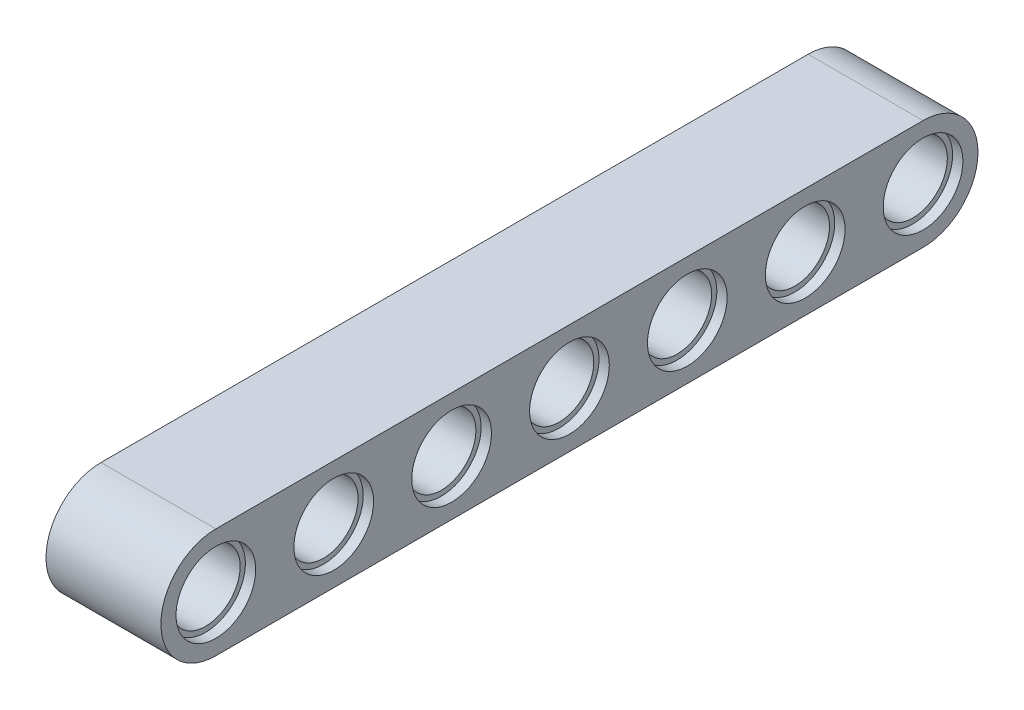
ISO-10303-21;
HEADER;
FILE_DESCRIPTION(('STEP AP214'),'2;1');
FILE_NAME('part.step','',(''),(''),'','','');
FILE_SCHEMA(('AUTOMOTIVE_DESIGN { 1 0 10303 214 1 1 1 1 }'));
ENDSEC;
DATA;
#1=APPLICATION_CONTEXT('core data for automotive mechanical design processes');
#2=APPLICATION_PROTOCOL_DEFINITION('international standard','automotive_design',2000,#1);
#3=PRODUCT_CONTEXT('',#1,'mechanical');
#4=PRODUCT('Part','Part','',(#3));
#5=PRODUCT_RELATED_PRODUCT_CATEGORY('part','',(#4));
#6=PRODUCT_DEFINITION_FORMATION('','',#4);
#7=PRODUCT_DEFINITION_CONTEXT('part definition',#1,'design');
#8=PRODUCT_DEFINITION('design','',#6,#7);
#9=PRODUCT_DEFINITION_SHAPE('','',#8);
#10=(LENGTH_UNIT() NAMED_UNIT(*) SI_UNIT(.MILLI.,.METRE.));
#11=(NAMED_UNIT(*) PLANE_ANGLE_UNIT() SI_UNIT($,.RADIAN.));
#12=(NAMED_UNIT(*) SI_UNIT($,.STERADIAN.) SOLID_ANGLE_UNIT());
#13=UNCERTAINTY_MEASURE_WITH_UNIT(LENGTH_MEASURE(1.E-05),#10,'distance_accuracy_value','');
#14=(GEOMETRIC_REPRESENTATION_CONTEXT(3) GLOBAL_UNCERTAINTY_ASSIGNED_CONTEXT((#13)) GLOBAL_UNIT_ASSIGNED_CONTEXT((#10,
#11,#12)) REPRESENTATION_CONTEXT('',''));
#15=CARTESIAN_POINT('',(0.,0.,0.));
#16=DIRECTION('',(0.,0.,1.));
#17=DIRECTION('',(1.,0.,0.));
#18=AXIS2_PLACEMENT_3D('',#15,#16,#17);
#19=CARTESIAN_POINT('',(7.8,0.,16.));
#20=DIRECTION('',(-1.,0.,0.));
#21=DIRECTION('',(0.,0.,1.));
#22=AXIS2_PLACEMENT_3D('',#19,#20,#21);
#23=CYLINDRICAL_SURFACE('',#22,2.35);
#24=CARTESIAN_POINT('',(0.7,0.,16.));
#25=DIRECTION('',(-1.,0.,0.));
#26=DIRECTION('',(0.,0.,1.));
#27=AXIS2_PLACEMENT_3D('',#24,#25,#26);
#28=CIRCLE('',#27,2.35);
#29=CARTESIAN_POINT('',(0.7,0.,18.35));
#30=VERTEX_POINT('',#29);
#31=EDGE_CURVE('E125',#30,#30,#28,.T.);
#32=ORIENTED_EDGE('',*,*,#31,.T.);
#33=EDGE_LOOP('',(#32));
#34=FACE_BOUND('',#33,.T.);
#35=CARTESIAN_POINT('',(7.1,0.,16.));
#36=DIRECTION('',(1.,0.,0.));
#37=DIRECTION('',(0.,0.,-1.));
#38=AXIS2_PLACEMENT_3D('',#35,#36,#37);
#39=CIRCLE('',#38,2.35);
#40=CARTESIAN_POINT('',(7.1,0.,13.65));
#41=VERTEX_POINT('',#40);
#42=EDGE_CURVE('E37',#41,#41,#39,.T.);
#43=ORIENTED_EDGE('',*,*,#42,.T.);
#44=EDGE_LOOP('',(#43));
#45=FACE_BOUND('',#44,.T.);
#46=ADVANCED_FACE('F33',(#34,#45),#23,.F.);
#47=CARTESIAN_POINT('',(7.8,0.,8.));
#48=DIRECTION('',(-1.,0.,0.));
#49=DIRECTION('',(0.,0.,1.));
#50=AXIS2_PLACEMENT_3D('',#47,#48,#49);
#51=CYLINDRICAL_SURFACE('',#50,2.35);
#52=CARTESIAN_POINT('',(0.7,0.,8.));
#53=DIRECTION('',(-1.,0.,0.));
#54=DIRECTION('',(0.,0.,1.));
#55=AXIS2_PLACEMENT_3D('',#52,#53,#54);
#56=CIRCLE('',#55,2.35);
#57=CARTESIAN_POINT('',(0.7,0.,10.35));
#58=VERTEX_POINT('',#57);
#59=EDGE_CURVE('E122',#58,#58,#56,.T.);
#60=ORIENTED_EDGE('',*,*,#59,.T.);
#61=EDGE_LOOP('',(#60));
#62=FACE_BOUND('',#61,.T.);
#63=CARTESIAN_POINT('',(7.1,0.,8.));
#64=DIRECTION('',(1.,0.,0.));
#65=DIRECTION('',(0.,0.,-1.));
#66=AXIS2_PLACEMENT_3D('',#63,#64,#65);
#67=CIRCLE('',#66,2.35);
#68=CARTESIAN_POINT('',(7.1,0.,5.65));
#69=VERTEX_POINT('',#68);
#70=EDGE_CURVE('E149',#69,#69,#67,.T.);
#71=ORIENTED_EDGE('',*,*,#70,.T.);
#72=EDGE_LOOP('',(#71));
#73=FACE_BOUND('',#72,.T.);
#74=ADVANCED_FACE('F225',(#62,#73),#51,.F.);
#75=CARTESIAN_POINT('',(7.8,0.,0.));
#76=DIRECTION('',(-1.,0.,0.));
#77=DIRECTION('',(0.,0.,1.));
#78=AXIS2_PLACEMENT_3D('',#75,#76,#77);
#79=CYLINDRICAL_SURFACE('',#78,2.35);
#80=CARTESIAN_POINT('',(0.7,0.,0.));
#81=DIRECTION('',(-1.,0.,0.));
#82=DIRECTION('',(0.,0.,1.));
#83=AXIS2_PLACEMENT_3D('',#80,#81,#82);
#84=CIRCLE('',#83,2.35);
#85=CARTESIAN_POINT('',(0.7,0.,2.34999999999999));
#86=VERTEX_POINT('',#85);
#87=EDGE_CURVE('E119',#86,#86,#84,.T.);
#88=ORIENTED_EDGE('',*,*,#87,.T.);
#89=EDGE_LOOP('',(#88));
#90=FACE_BOUND('',#89,.T.);
#91=CARTESIAN_POINT('',(7.1,0.,0.));
#92=DIRECTION('',(1.,0.,0.));
#93=DIRECTION('',(0.,0.,-1.));
#94=AXIS2_PLACEMENT_3D('',#91,#92,#93);
#95=CIRCLE('',#94,2.35);
#96=CARTESIAN_POINT('',(7.1,0.,-2.35));
#97=VERTEX_POINT('',#96);
#98=EDGE_CURVE('E147',#97,#97,#95,.T.);
#99=ORIENTED_EDGE('',*,*,#98,.T.);
#100=EDGE_LOOP('',(#99));
#101=FACE_BOUND('',#100,.T.);
#102=ADVANCED_FACE('F231',(#90,#101),#79,.F.);
#103=CARTESIAN_POINT('',(7.8,0.,-8.));
#104=DIRECTION('',(-1.,0.,0.));
#105=DIRECTION('',(0.,0.,1.));
#106=AXIS2_PLACEMENT_3D('',#103,#104,#105);
#107=CYLINDRICAL_SURFACE('',#106,2.35);
#108=CARTESIAN_POINT('',(0.7,0.,-8.));
#109=DIRECTION('',(-1.,0.,0.));
#110=DIRECTION('',(0.,0.,1.));
#111=AXIS2_PLACEMENT_3D('',#108,#109,#110);
#112=CIRCLE('',#111,2.35);
#113=CARTESIAN_POINT('',(0.7,0.,-5.65000000000001));
#114=VERTEX_POINT('',#113);
#115=EDGE_CURVE('E115',#114,#114,#112,.T.);
#116=ORIENTED_EDGE('',*,*,#115,.T.);
#117=EDGE_LOOP('',(#116));
#118=FACE_BOUND('',#117,.T.);
#119=CARTESIAN_POINT('',(7.1,0.,-8.));
#120=DIRECTION('',(1.,0.,0.));
#121=DIRECTION('',(0.,0.,-1.));
#122=AXIS2_PLACEMENT_3D('',#119,#120,#121);
#123=CIRCLE('',#122,2.35);
#124=CARTESIAN_POINT('',(7.1,0.,-10.35));
#125=VERTEX_POINT('',#124);
#126=EDGE_CURVE('E144',#125,#125,#123,.T.);
#127=ORIENTED_EDGE('',*,*,#126,.T.);
#128=EDGE_LOOP('',(#127));
#129=FACE_BOUND('',#128,.T.);
#130=ADVANCED_FACE('F411',(#118,#129),#107,.F.);
#131=CARTESIAN_POINT('',(7.8,0.,-16.));
#132=DIRECTION('',(-1.,0.,0.));
#133=DIRECTION('',(0.,0.,1.));
#134=AXIS2_PLACEMENT_3D('',#131,#132,#133);
#135=CYLINDRICAL_SURFACE('',#134,2.35);
#136=CARTESIAN_POINT('',(0.7,0.,-16.));
#137=DIRECTION('',(-1.,0.,0.));
#138=DIRECTION('',(0.,0.,1.));
#139=AXIS2_PLACEMENT_3D('',#136,#137,#138);
#140=CIRCLE('',#139,2.35);
#141=CARTESIAN_POINT('',(0.7,0.,-13.65));
#142=VERTEX_POINT('',#141);
#143=EDGE_CURVE('E112',#142,#142,#140,.T.);
#144=ORIENTED_EDGE('',*,*,#143,.T.);
#145=EDGE_LOOP('',(#144));
#146=FACE_BOUND('',#145,.T.);
#147=CARTESIAN_POINT('',(7.1,0.,-16.));
#148=DIRECTION('',(1.,0.,0.));
#149=DIRECTION('',(0.,0.,-1.));
#150=AXIS2_PLACEMENT_3D('',#147,#148,#149);
#151=CIRCLE('',#150,2.35);
#152=CARTESIAN_POINT('',(7.1,0.,-18.35));
#153=VERTEX_POINT('',#152);
#154=EDGE_CURVE('E140',#153,#153,#151,.T.);
#155=ORIENTED_EDGE('',*,*,#154,.T.);
#156=EDGE_LOOP('',(#155));
#157=FACE_BOUND('',#156,.T.);
#158=ADVANCED_FACE('F407',(#146,#157),#135,.F.);
#159=CARTESIAN_POINT('',(7.8,0.,-24.));
#160=DIRECTION('',(-1.,0.,0.));
#161=DIRECTION('',(0.,0.,1.));
#162=AXIS2_PLACEMENT_3D('',#159,#160,#161);
#163=CYLINDRICAL_SURFACE('',#162,2.35);
#164=CARTESIAN_POINT('',(0.7,0.,-24.));
#165=DIRECTION('',(-1.,0.,0.));
#166=DIRECTION('',(0.,0.,1.));
#167=AXIS2_PLACEMENT_3D('',#164,#165,#166);
#168=CIRCLE('',#167,2.35);
#169=CARTESIAN_POINT('',(0.7,0.,-21.65));
#170=VERTEX_POINT('',#169);
#171=EDGE_CURVE('E103',#170,#170,#168,.T.);
#172=ORIENTED_EDGE('',*,*,#171,.T.);
#173=EDGE_LOOP('',(#172));
#174=FACE_BOUND('',#173,.T.);
#175=CARTESIAN_POINT('',(7.1,0.,-24.));
#176=DIRECTION('',(1.,0.,0.));
#177=DIRECTION('',(0.,0.,-1.));
#178=AXIS2_PLACEMENT_3D('',#175,#176,#177);
#179=CIRCLE('',#178,2.35);
#180=CARTESIAN_POINT('',(7.1,0.,-26.35));
#181=VERTEX_POINT('',#180);
#182=EDGE_CURVE('E137',#181,#181,#179,.T.);
#183=ORIENTED_EDGE('',*,*,#182,.T.);
#184=EDGE_LOOP('',(#183));
#185=FACE_BOUND('',#184,.T.);
#186=ADVANCED_FACE('F239',(#174,#185),#163,.F.);
#187=CARTESIAN_POINT('',(7.8,0.,24.));
#188=DIRECTION('',(-1.,0.,0.));
#189=DIRECTION('',(0.,0.,1.));
#190=AXIS2_PLACEMENT_3D('',#187,#188,#189);
#191=CYLINDRICAL_SURFACE('',#190,2.35);
#192=CARTESIAN_POINT('',(0.7,0.,24.));
#193=DIRECTION('',(-1.,0.,0.));
#194=DIRECTION('',(0.,0.,1.));
#195=AXIS2_PLACEMENT_3D('',#192,#193,#194);
#196=CIRCLE('',#195,2.35);
#197=CARTESIAN_POINT('',(0.7,0.,26.35));
#198=VERTEX_POINT('',#197);
#199=EDGE_CURVE('E128',#198,#198,#196,.T.);
#200=ORIENTED_EDGE('',*,*,#199,.T.);
#201=EDGE_LOOP('',(#200));
#202=FACE_BOUND('',#201,.T.);
#203=CARTESIAN_POINT('',(7.1,0.,24.));
#204=DIRECTION('',(1.,0.,0.));
#205=DIRECTION('',(0.,0.,-1.));
#206=AXIS2_PLACEMENT_3D('',#203,#204,#205);
#207=CIRCLE('',#206,2.35);
#208=CARTESIAN_POINT('',(7.1,0.,21.65));
#209=VERTEX_POINT('',#208);
#210=EDGE_CURVE('E132',#209,#209,#207,.T.);
#211=ORIENTED_EDGE('',*,*,#210,.T.);
#212=EDGE_LOOP('',(#211));
#213=FACE_BOUND('',#212,.T.);
#214=ADVANCED_FACE('F236',(#202,#213),#191,.F.);
#215=CARTESIAN_POINT('',(7.8,0.,-24.));
#216=DIRECTION('',(1.,0.,0.));
#217=DIRECTION('',(0.,0.,-1.));
#218=AXIS2_PLACEMENT_3D('',#215,#216,#217);
#219=PLANE('',#218);
#220=CARTESIAN_POINT('',(7.8,0.,16.));
#221=DIRECTION('',(1.,0.,0.));
#222=DIRECTION('',(0.,0.,-1.));
#223=AXIS2_PLACEMENT_3D('',#220,#221,#222);
#224=CIRCLE('',#223,2.705);
#225=CARTESIAN_POINT('',(7.8,0.,13.295));
#226=VERTEX_POINT('',#225);
#227=EDGE_CURVE('E248',#226,#226,#224,.T.);
#228=ORIENTED_EDGE('',*,*,#227,.F.);
#229=EDGE_LOOP('',(#228));
#230=FACE_BOUND('',#229,.T.);
#231=CARTESIAN_POINT('',(7.8,0.,8.));
#232=DIRECTION('',(1.,0.,0.));
#233=DIRECTION('',(0.,0.,-1.));
#234=AXIS2_PLACEMENT_3D('',#231,#232,#233);
#235=CIRCLE('',#234,2.705);
#236=CARTESIAN_POINT('',(7.8,0.,5.295));
#237=VERTEX_POINT('',#236);
#238=EDGE_CURVE('E252',#237,#237,#235,.T.);
#239=ORIENTED_EDGE('',*,*,#238,.F.);
#240=EDGE_LOOP('',(#239));
#241=FACE_BOUND('',#240,.T.);
#242=CARTESIAN_POINT('',(7.8,0.,0.));
#243=DIRECTION('',(1.,0.,0.));
#244=DIRECTION('',(0.,0.,-1.));
#245=AXIS2_PLACEMENT_3D('',#242,#243,#244);
#246=CIRCLE('',#245,2.705);
#247=CARTESIAN_POINT('',(7.8,0.,-2.705));
#248=VERTEX_POINT('',#247);
#249=EDGE_CURVE('E256',#248,#248,#246,.T.);
#250=ORIENTED_EDGE('',*,*,#249,.F.);
#251=EDGE_LOOP('',(#250));
#252=FACE_BOUND('',#251,.T.);
#253=CARTESIAN_POINT('',(7.8,0.,-8.));
#254=DIRECTION('',(1.,0.,0.));
#255=DIRECTION('',(0.,0.,-1.));
#256=AXIS2_PLACEMENT_3D('',#253,#254,#255);
#257=CIRCLE('',#256,2.705);
#258=CARTESIAN_POINT('',(7.8,0.,-10.705));
#259=VERTEX_POINT('',#258);
#260=EDGE_CURVE('E260',#259,#259,#257,.T.);
#261=ORIENTED_EDGE('',*,*,#260,.F.);
#262=EDGE_LOOP('',(#261));
#263=FACE_BOUND('',#262,.T.);
#264=CARTESIAN_POINT('',(7.8,0.,-16.));
#265=DIRECTION('',(1.,0.,0.));
#266=DIRECTION('',(0.,0.,-1.));
#267=AXIS2_PLACEMENT_3D('',#264,#265,#266);
#268=CIRCLE('',#267,2.705);
#269=CARTESIAN_POINT('',(7.8,0.,-18.705));
#270=VERTEX_POINT('',#269);
#271=EDGE_CURVE('E264',#270,#270,#268,.T.);
#272=ORIENTED_EDGE('',*,*,#271,.F.);
#273=EDGE_LOOP('',(#272));
#274=FACE_BOUND('',#273,.T.);
#275=CARTESIAN_POINT('',(7.8,0.,-24.));
#276=DIRECTION('',(1.,0.,0.));
#277=DIRECTION('',(0.,0.,-1.));
#278=AXIS2_PLACEMENT_3D('',#275,#276,#277);
#279=CIRCLE('',#278,2.705);
#280=CARTESIAN_POINT('',(7.8,0.,-26.705));
#281=VERTEX_POINT('',#280);
#282=EDGE_CURVE('E268',#281,#281,#279,.T.);
#283=ORIENTED_EDGE('',*,*,#282,.F.);
#284=EDGE_LOOP('',(#283));
#285=FACE_BOUND('',#284,.T.);
#286=CARTESIAN_POINT('',(7.8,0.,24.));
#287=DIRECTION('',(1.,0.,0.));
#288=DIRECTION('',(0.,0.,-1.));
#289=AXIS2_PLACEMENT_3D('',#286,#287,#288);
#290=CIRCLE('',#289,2.705);
#291=CARTESIAN_POINT('',(7.8,0.,21.295));
#292=VERTEX_POINT('',#291);
#293=EDGE_CURVE('E154',#292,#292,#290,.T.);
#294=ORIENTED_EDGE('',*,*,#293,.F.);
#295=EDGE_LOOP('',(#294));
#296=FACE_BOUND('',#295,.T.);
#297=CARTESIAN_POINT('',(7.8,0.,-24.));
#298=DIRECTION('',(1.,0.,0.));
#299=DIRECTION('',(0.,0.,-1.));
#300=AXIS2_PLACEMENT_3D('',#297,#298,#299);
#301=CIRCLE('',#300,3.73);
#302=CARTESIAN_POINT('',(7.8,-3.73,-24.));
#303=VERTEX_POINT('',#302);
#304=CARTESIAN_POINT('',(7.8,3.73,-24.));
#305=VERTEX_POINT('',#304);
#306=EDGE_CURVE('E87',#303,#305,#301,.T.);
#307=ORIENTED_EDGE('',*,*,#306,.T.);
#308=DIRECTION('',(0.,0.,1.));
#309=VECTOR('',#308,1.);
#310=CARTESIAN_POINT('',(7.8,3.73,24.));
#311=LINE('',#310,#309);
#312=CARTESIAN_POINT('',(7.8,3.73,24.));
#313=VERTEX_POINT('',#312);
#314=EDGE_CURVE('E82',#305,#313,#311,.T.);
#315=ORIENTED_EDGE('',*,*,#314,.T.);
#316=CARTESIAN_POINT('',(7.8,0.,24.));
#317=DIRECTION('',(1.,0.,0.));
#318=DIRECTION('',(0.,0.,-1.));
#319=AXIS2_PLACEMENT_3D('',#316,#317,#318);
#320=CIRCLE('',#319,3.73);
#321=CARTESIAN_POINT('',(7.8,-3.73,24.));
#322=VERTEX_POINT('',#321);
#323=EDGE_CURVE('E85',#313,#322,#320,.T.);
#324=ORIENTED_EDGE('',*,*,#323,.T.);
#325=DIRECTION('',(0.,0.,-1.));
#326=VECTOR('',#325,1.);
#327=CARTESIAN_POINT('',(7.8,-3.73,24.));
#328=LINE('',#327,#326);
#329=EDGE_CURVE('E52',#322,#303,#328,.T.);
#330=ORIENTED_EDGE('',*,*,#329,.T.);
#331=EDGE_LOOP('',(#307,#315,#324,#330));
#332=FACE_BOUND('',#331,.T.);
#333=ADVANCED_FACE('F83',(#230,#241,#252,#263,#274,#285,#296,#332),#219,.T.);
#334=CARTESIAN_POINT('',(0.,0.,-24.));
#335=DIRECTION('',(1.,0.,0.));
#336=DIRECTION('',(0.,0.,-1.));
#337=AXIS2_PLACEMENT_3D('',#334,#335,#336);
#338=PLANE('',#337);
#339=CARTESIAN_POINT('',(0.,0.,-16.));
#340=DIRECTION('',(-1.,0.,0.));
#341=DIRECTION('',(0.,0.,1.));
#342=AXIS2_PLACEMENT_3D('',#339,#340,#341);
#343=CIRCLE('',#342,2.705);
#344=CARTESIAN_POINT('',(0.,0.,-13.295));
#345=VERTEX_POINT('',#344);
#346=EDGE_CURVE('E167',#345,#345,#343,.T.);
#347=ORIENTED_EDGE('',*,*,#346,.F.);
#348=EDGE_LOOP('',(#347));
#349=FACE_BOUND('',#348,.T.);
#350=CARTESIAN_POINT('',(0.,0.,-8.));
#351=DIRECTION('',(-1.,0.,0.));
#352=DIRECTION('',(0.,0.,1.));
#353=AXIS2_PLACEMENT_3D('',#350,#351,#352);
#354=CIRCLE('',#353,2.705);
#355=CARTESIAN_POINT('',(0.,0.,-5.295));
#356=VERTEX_POINT('',#355);
#357=EDGE_CURVE('E173',#356,#356,#354,.T.);
#358=ORIENTED_EDGE('',*,*,#357,.F.);
#359=EDGE_LOOP('',(#358));
#360=FACE_BOUND('',#359,.T.);
#361=CARTESIAN_POINT('',(0.,0.,0.));
#362=DIRECTION('',(-1.,0.,0.));
#363=DIRECTION('',(0.,0.,1.));
#364=AXIS2_PLACEMENT_3D('',#361,#362,#363);
#365=CIRCLE('',#364,2.705);
#366=CARTESIAN_POINT('',(0.,0.,2.705));
#367=VERTEX_POINT('',#366);
#368=EDGE_CURVE('E179',#367,#367,#365,.T.);
#369=ORIENTED_EDGE('',*,*,#368,.F.);
#370=EDGE_LOOP('',(#369));
#371=FACE_BOUND('',#370,.T.);
#372=CARTESIAN_POINT('',(0.,0.,8.));
#373=DIRECTION('',(-1.,0.,0.));
#374=DIRECTION('',(0.,0.,1.));
#375=AXIS2_PLACEMENT_3D('',#372,#373,#374);
#376=CIRCLE('',#375,2.705);
#377=CARTESIAN_POINT('',(0.,0.,10.705));
#378=VERTEX_POINT('',#377);
#379=EDGE_CURVE('E185',#378,#378,#376,.T.);
#380=ORIENTED_EDGE('',*,*,#379,.F.);
#381=EDGE_LOOP('',(#380));
#382=FACE_BOUND('',#381,.T.);
#383=CARTESIAN_POINT('',(0.,0.,16.));
#384=DIRECTION('',(-1.,0.,0.));
#385=DIRECTION('',(0.,0.,1.));
#386=AXIS2_PLACEMENT_3D('',#383,#384,#385);
#387=CIRCLE('',#386,2.705);
#388=CARTESIAN_POINT('',(0.,0.,18.705));
#389=VERTEX_POINT('',#388);
#390=EDGE_CURVE('E191',#389,#389,#387,.T.);
#391=ORIENTED_EDGE('',*,*,#390,.F.);
#392=EDGE_LOOP('',(#391));
#393=FACE_BOUND('',#392,.T.);
#394=CARTESIAN_POINT('',(0.,0.,24.));
#395=DIRECTION('',(-1.,0.,0.));
#396=DIRECTION('',(0.,0.,1.));
#397=AXIS2_PLACEMENT_3D('',#394,#395,#396);
#398=CIRCLE('',#397,2.705);
#399=CARTESIAN_POINT('',(0.,0.,26.705));
#400=VERTEX_POINT('',#399);
#401=EDGE_CURVE('E135',#400,#400,#398,.T.);
#402=ORIENTED_EDGE('',*,*,#401,.F.);
#403=EDGE_LOOP('',(#402));
#404=FACE_BOUND('',#403,.T.);
#405=CARTESIAN_POINT('',(0.,0.,-24.));
#406=DIRECTION('',(-1.,0.,0.));
#407=DIRECTION('',(0.,0.,1.));
#408=AXIS2_PLACEMENT_3D('',#405,#406,#407);
#409=CIRCLE('',#408,2.705);
#410=CARTESIAN_POINT('',(0.,0.,-21.295));
#411=VERTEX_POINT('',#410);
#412=EDGE_CURVE('E131',#411,#411,#409,.T.);
#413=ORIENTED_EDGE('',*,*,#412,.F.);
#414=EDGE_LOOP('',(#413));
#415=FACE_BOUND('',#414,.T.);
#416=CARTESIAN_POINT('',(0.,0.,-24.));
#417=DIRECTION('',(1.,0.,0.));
#418=DIRECTION('',(0.,0.,-1.));
#419=AXIS2_PLACEMENT_3D('',#416,#417,#418);
#420=CIRCLE('',#419,3.73);
#421=CARTESIAN_POINT('',(0.,-3.73,-24.));
#422=VERTEX_POINT('',#421);
#423=CARTESIAN_POINT('',(0.,3.73,-24.));
#424=VERTEX_POINT('',#423);
#425=EDGE_CURVE('E100',#422,#424,#420,.T.);
#426=ORIENTED_EDGE('',*,*,#425,.F.);
#427=DIRECTION('',(0.,0.,-1.));
#428=VECTOR('',#427,1.);
#429=CARTESIAN_POINT('',(0.,-3.73,24.));
#430=LINE('',#429,#428);
#431=CARTESIAN_POINT('',(0.,-3.73,24.));
#432=VERTEX_POINT('',#431);
#433=EDGE_CURVE('E75',#432,#422,#430,.T.);
#434=ORIENTED_EDGE('',*,*,#433,.F.);
#435=CARTESIAN_POINT('',(0.,0.,24.));
#436=DIRECTION('',(1.,0.,0.));
#437=DIRECTION('',(0.,0.,-1.));
#438=AXIS2_PLACEMENT_3D('',#435,#436,#437);
#439=CIRCLE('',#438,3.73);
#440=CARTESIAN_POINT('',(0.,3.73,24.));
#441=VERTEX_POINT('',#440);
#442=EDGE_CURVE('E69',#441,#432,#439,.T.);
#443=ORIENTED_EDGE('',*,*,#442,.F.);
#444=DIRECTION('',(0.,0.,1.));
#445=VECTOR('',#444,1.);
#446=CARTESIAN_POINT('',(0.,3.73,24.));
#447=LINE('',#446,#445);
#448=EDGE_CURVE('E91',#424,#441,#447,.T.);
#449=ORIENTED_EDGE('',*,*,#448,.F.);
#450=EDGE_LOOP('',(#426,#434,#443,#449));
#451=FACE_BOUND('',#450,.T.);
#452=ADVANCED_FACE('F206',(#349,#360,#371,#382,#393,#404,#415,#451),#338,.F.);
#453=CARTESIAN_POINT('',(7.8,0.,-24.));
#454=DIRECTION('',(-1.,0.,0.));
#455=DIRECTION('',(0.,0.,1.));
#456=AXIS2_PLACEMENT_3D('',#453,#454,#455);
#457=CYLINDRICAL_SURFACE('',#456,3.73);
#458=ORIENTED_EDGE('',*,*,#425,.T.);
#459=DIRECTION('',(-1.,0.,0.));
#460=VECTOR('',#459,1.);
#461=CARTESIAN_POINT('',(7.8,3.73,-24.));
#462=LINE('',#461,#460);
#463=EDGE_CURVE('E11',#305,#424,#462,.T.);
#464=ORIENTED_EDGE('',*,*,#463,.F.);
#465=ORIENTED_EDGE('',*,*,#306,.F.);
#466=DIRECTION('',(-1.,0.,0.));
#467=VECTOR('',#466,1.);
#468=CARTESIAN_POINT('',(7.8,-3.73,-24.));
#469=LINE('',#468,#467);
#470=EDGE_CURVE('E96',#303,#422,#469,.T.);
#471=ORIENTED_EDGE('',*,*,#470,.T.);
#472=EDGE_LOOP('',(#458,#464,#465,#471));
#473=FACE_BOUND('',#472,.T.);
#474=ADVANCED_FACE('F35',(#473),#457,.T.);
#475=CARTESIAN_POINT('',(7.8,3.73,24.));
#476=DIRECTION('',(0.,-1.,0.));
#477=DIRECTION('',(0.,0.,-1.));
#478=AXIS2_PLACEMENT_3D('',#475,#476,#477);
#479=PLANE('',#478);
#480=ORIENTED_EDGE('',*,*,#448,.T.);
#481=DIRECTION('',(-1.,0.,0.));
#482=VECTOR('',#481,1.);
#483=CARTESIAN_POINT('',(7.8,3.73,24.));
#484=LINE('',#483,#482);
#485=EDGE_CURVE('E43',#313,#441,#484,.T.);
#486=ORIENTED_EDGE('',*,*,#485,.F.);
#487=ORIENTED_EDGE('',*,*,#314,.F.);
#488=ORIENTED_EDGE('',*,*,#463,.T.);
#489=EDGE_LOOP('',(#480,#486,#487,#488));
#490=FACE_BOUND('',#489,.T.);
#491=ADVANCED_FACE('F90',(#490),#479,.F.);
#492=CARTESIAN_POINT('',(7.8,0.,24.));
#493=DIRECTION('',(-1.,0.,0.));
#494=DIRECTION('',(0.,0.,1.));
#495=AXIS2_PLACEMENT_3D('',#492,#493,#494);
#496=CYLINDRICAL_SURFACE('',#495,3.73);
#497=ORIENTED_EDGE('',*,*,#442,.T.);
#498=DIRECTION('',(-1.,0.,0.));
#499=VECTOR('',#498,1.);
#500=CARTESIAN_POINT('',(7.8,-3.73,24.));
#501=LINE('',#500,#499);
#502=EDGE_CURVE('E92',#322,#432,#501,.T.);
#503=ORIENTED_EDGE('',*,*,#502,.F.);
#504=ORIENTED_EDGE('',*,*,#323,.F.);
#505=ORIENTED_EDGE('',*,*,#485,.T.);
#506=EDGE_LOOP('',(#497,#503,#504,#505));
#507=FACE_BOUND('',#506,.T.);
#508=ADVANCED_FACE('F94',(#507),#496,.T.);
#509=CARTESIAN_POINT('',(7.8,-3.73,24.));
#510=DIRECTION('',(0.,1.,0.));
#511=DIRECTION('',(0.,0.,1.));
#512=AXIS2_PLACEMENT_3D('',#509,#510,#511);
#513=PLANE('',#512);
#514=ORIENTED_EDGE('',*,*,#433,.T.);
#515=ORIENTED_EDGE('',*,*,#470,.F.);
#516=ORIENTED_EDGE('',*,*,#329,.F.);
#517=ORIENTED_EDGE('',*,*,#502,.T.);
#518=EDGE_LOOP('',(#514,#515,#516,#517));
#519=FACE_BOUND('',#518,.T.);
#520=ADVANCED_FACE('F213',(#519),#513,.F.);
#521=CARTESIAN_POINT('',(0.7,0.,-24.));
#522=DIRECTION('',(-1.,0.,0.));
#523=DIRECTION('',(0.,0.,1.));
#524=AXIS2_PLACEMENT_3D('',#521,#522,#523);
#525=CYLINDRICAL_SURFACE('',#524,2.705);
#526=CARTESIAN_POINT('',(0.7,0.,-24.));
#527=DIRECTION('',(-1.,0.,0.));
#528=DIRECTION('',(0.,0.,1.));
#529=AXIS2_PLACEMENT_3D('',#526,#527,#528);
#530=CIRCLE('',#529,2.705);
#531=CARTESIAN_POINT('',(0.7,0.,-21.295));
#532=VERTEX_POINT('',#531);
#533=EDGE_CURVE('E111',#532,#532,#530,.T.);
#534=ORIENTED_EDGE('',*,*,#533,.F.);
#535=EDGE_LOOP('',(#534));
#536=FACE_BOUND('',#535,.T.);
#537=ORIENTED_EDGE('',*,*,#412,.T.);
#538=EDGE_LOOP('',(#537));
#539=FACE_BOUND('',#538,.T.);
#540=ADVANCED_FACE('F204',(#536,#539),#525,.F.);
#541=CARTESIAN_POINT('',(0.7,0.,-24.));
#542=DIRECTION('',(-1.,0.,0.));
#543=DIRECTION('',(0.,0.,1.));
#544=AXIS2_PLACEMENT_3D('',#541,#542,#543);
#545=PLANE('',#544);
#546=ORIENTED_EDGE('',*,*,#171,.F.);
#547=EDGE_LOOP('',(#546));
#548=FACE_BOUND('',#547,.T.);
#549=ORIENTED_EDGE('',*,*,#533,.T.);
#550=EDGE_LOOP('',(#549));
#551=FACE_BOUND('',#550,.T.);
#552=ADVANCED_FACE('F220',(#548,#551),#545,.T.);
#553=CARTESIAN_POINT('',(0.7,0.,-16.));
#554=DIRECTION('',(-1.,0.,0.));
#555=DIRECTION('',(0.,0.,1.));
#556=AXIS2_PLACEMENT_3D('',#553,#554,#555);
#557=CYLINDRICAL_SURFACE('',#556,2.705);
#558=CARTESIAN_POINT('',(0.7,0.,-16.));
#559=DIRECTION('',(-1.,0.,0.));
#560=DIRECTION('',(0.,0.,1.));
#561=AXIS2_PLACEMENT_3D('',#558,#559,#560);
#562=CIRCLE('',#561,2.705);
#563=CARTESIAN_POINT('',(0.7,0.,-13.295));
#564=VERTEX_POINT('',#563);
#565=EDGE_CURVE('E116',#564,#564,#562,.T.);
#566=ORIENTED_EDGE('',*,*,#565,.F.);
#567=EDGE_LOOP('',(#566));
#568=FACE_BOUND('',#567,.T.);
#569=ORIENTED_EDGE('',*,*,#346,.T.);
#570=EDGE_LOOP('',(#569));
#571=FACE_BOUND('',#570,.T.);
#572=ADVANCED_FACE('F359',(#568,#571),#557,.F.);
#573=CARTESIAN_POINT('',(0.7,0.,-16.));
#574=DIRECTION('',(-1.,0.,0.));
#575=DIRECTION('',(0.,0.,1.));
#576=AXIS2_PLACEMENT_3D('',#573,#574,#575);
#577=PLANE('',#576);
#578=ORIENTED_EDGE('',*,*,#143,.F.);
#579=EDGE_LOOP('',(#578));
#580=FACE_BOUND('',#579,.T.);
#581=ORIENTED_EDGE('',*,*,#565,.T.);
#582=EDGE_LOOP('',(#581));
#583=FACE_BOUND('',#582,.T.);
#584=ADVANCED_FACE('F355',(#580,#583),#577,.T.);
#585=CARTESIAN_POINT('',(0.7,0.,-8.));
#586=DIRECTION('',(-1.,0.,0.));
#587=DIRECTION('',(0.,0.,1.));
#588=AXIS2_PLACEMENT_3D('',#585,#586,#587);
#589=CYLINDRICAL_SURFACE('',#588,2.705);
#590=CARTESIAN_POINT('',(0.7,0.,-8.));
#591=DIRECTION('',(-1.,0.,0.));
#592=DIRECTION('',(0.,0.,1.));
#593=AXIS2_PLACEMENT_3D('',#590,#591,#592);
#594=CIRCLE('',#593,2.705);
#595=CARTESIAN_POINT('',(0.7,0.,-5.295));
#596=VERTEX_POINT('',#595);
#597=EDGE_CURVE('E170',#596,#596,#594,.T.);
#598=ORIENTED_EDGE('',*,*,#597,.F.);
#599=EDGE_LOOP('',(#598));
#600=FACE_BOUND('',#599,.T.);
#601=ORIENTED_EDGE('',*,*,#357,.T.);
#602=EDGE_LOOP('',(#601));
#603=FACE_BOUND('',#602,.T.);
#604=ADVANCED_FACE('F358',(#600,#603),#589,.F.);
#605=CARTESIAN_POINT('',(0.7,0.,-8.));
#606=DIRECTION('',(-1.,0.,0.));
#607=DIRECTION('',(0.,0.,1.));
#608=AXIS2_PLACEMENT_3D('',#605,#606,#607);
#609=PLANE('',#608);
#610=ORIENTED_EDGE('',*,*,#115,.F.);
#611=EDGE_LOOP('',(#610));
#612=FACE_BOUND('',#611,.T.);
#613=ORIENTED_EDGE('',*,*,#597,.T.);
#614=EDGE_LOOP('',(#613));
#615=FACE_BOUND('',#614,.T.);
#616=ADVANCED_FACE('F364',(#612,#615),#609,.T.);
#617=CARTESIAN_POINT('',(0.7,0.,0.));
#618=DIRECTION('',(-1.,0.,0.));
#619=DIRECTION('',(0.,0.,1.));
#620=AXIS2_PLACEMENT_3D('',#617,#618,#619);
#621=CYLINDRICAL_SURFACE('',#620,2.705);
#622=CARTESIAN_POINT('',(0.7,0.,0.));
#623=DIRECTION('',(-1.,0.,0.));
#624=DIRECTION('',(0.,0.,1.));
#625=AXIS2_PLACEMENT_3D('',#622,#623,#624);
#626=CIRCLE('',#625,2.705);
#627=CARTESIAN_POINT('',(0.7,0.,2.705));
#628=VERTEX_POINT('',#627);
#629=EDGE_CURVE('E176',#628,#628,#626,.T.);
#630=ORIENTED_EDGE('',*,*,#629,.F.);
#631=EDGE_LOOP('',(#630));
#632=FACE_BOUND('',#631,.T.);
#633=ORIENTED_EDGE('',*,*,#368,.T.);
#634=EDGE_LOOP('',(#633));
#635=FACE_BOUND('',#634,.T.);
#636=ADVANCED_FACE('F367',(#632,#635),#621,.F.);
#637=CARTESIAN_POINT('',(0.7,0.,0.));
#638=DIRECTION('',(-1.,0.,0.));
#639=DIRECTION('',(0.,0.,1.));
#640=AXIS2_PLACEMENT_3D('',#637,#638,#639);
#641=PLANE('',#640);
#642=ORIENTED_EDGE('',*,*,#87,.F.);
#643=EDGE_LOOP('',(#642));
#644=FACE_BOUND('',#643,.T.);
#645=ORIENTED_EDGE('',*,*,#629,.T.);
#646=EDGE_LOOP('',(#645));
#647=FACE_BOUND('',#646,.T.);
#648=ADVANCED_FACE('F372',(#644,#647),#641,.T.);
#649=CARTESIAN_POINT('',(0.7,0.,8.));
#650=DIRECTION('',(-1.,0.,0.));
#651=DIRECTION('',(0.,0.,1.));
#652=AXIS2_PLACEMENT_3D('',#649,#650,#651);
#653=CYLINDRICAL_SURFACE('',#652,2.705);
#654=CARTESIAN_POINT('',(0.7,0.,8.));
#655=DIRECTION('',(-1.,0.,0.));
#656=DIRECTION('',(0.,0.,1.));
#657=AXIS2_PLACEMENT_3D('',#654,#655,#656);
#658=CIRCLE('',#657,2.705);
#659=CARTESIAN_POINT('',(0.7,0.,10.705));
#660=VERTEX_POINT('',#659);
#661=EDGE_CURVE('E182',#660,#660,#658,.T.);
#662=ORIENTED_EDGE('',*,*,#661,.F.);
#663=EDGE_LOOP('',(#662));
#664=FACE_BOUND('',#663,.T.);
#665=ORIENTED_EDGE('',*,*,#379,.T.);
#666=EDGE_LOOP('',(#665));
#667=FACE_BOUND('',#666,.T.);
#668=ADVANCED_FACE('F375',(#664,#667),#653,.F.);
#669=CARTESIAN_POINT('',(0.7,0.,8.));
#670=DIRECTION('',(-1.,0.,0.));
#671=DIRECTION('',(0.,0.,1.));
#672=AXIS2_PLACEMENT_3D('',#669,#670,#671);
#673=PLANE('',#672);
#674=ORIENTED_EDGE('',*,*,#59,.F.);
#675=EDGE_LOOP('',(#674));
#676=FACE_BOUND('',#675,.T.);
#677=ORIENTED_EDGE('',*,*,#661,.T.);
#678=EDGE_LOOP('',(#677));
#679=FACE_BOUND('',#678,.T.);
#680=ADVANCED_FACE('F380',(#676,#679),#673,.T.);
#681=CARTESIAN_POINT('',(0.7,0.,16.));
#682=DIRECTION('',(-1.,0.,0.));
#683=DIRECTION('',(0.,0.,1.));
#684=AXIS2_PLACEMENT_3D('',#681,#682,#683);
#685=CYLINDRICAL_SURFACE('',#684,2.705);
#686=CARTESIAN_POINT('',(0.7,0.,16.));
#687=DIRECTION('',(-1.,0.,0.));
#688=DIRECTION('',(0.,0.,1.));
#689=AXIS2_PLACEMENT_3D('',#686,#687,#688);
#690=CIRCLE('',#689,2.705);
#691=CARTESIAN_POINT('',(0.7,0.,18.705));
#692=VERTEX_POINT('',#691);
#693=EDGE_CURVE('E188',#692,#692,#690,.T.);
#694=ORIENTED_EDGE('',*,*,#693,.F.);
#695=EDGE_LOOP('',(#694));
#696=FACE_BOUND('',#695,.T.);
#697=ORIENTED_EDGE('',*,*,#390,.T.);
#698=EDGE_LOOP('',(#697));
#699=FACE_BOUND('',#698,.T.);
#700=ADVANCED_FACE('F383',(#696,#699),#685,.F.);
#701=CARTESIAN_POINT('',(0.7,0.,16.));
#702=DIRECTION('',(-1.,0.,0.));
#703=DIRECTION('',(0.,0.,1.));
#704=AXIS2_PLACEMENT_3D('',#701,#702,#703);
#705=PLANE('',#704);
#706=ORIENTED_EDGE('',*,*,#31,.F.);
#707=EDGE_LOOP('',(#706));
#708=FACE_BOUND('',#707,.T.);
#709=ORIENTED_EDGE('',*,*,#693,.T.);
#710=EDGE_LOOP('',(#709));
#711=FACE_BOUND('',#710,.T.);
#712=ADVANCED_FACE('F388',(#708,#711),#705,.T.);
#713=CARTESIAN_POINT('',(0.7,0.,24.));
#714=DIRECTION('',(-1.,0.,0.));
#715=DIRECTION('',(0.,0.,1.));
#716=AXIS2_PLACEMENT_3D('',#713,#714,#715);
#717=CYLINDRICAL_SURFACE('',#716,2.705);
#718=CARTESIAN_POINT('',(0.7,0.,24.));
#719=DIRECTION('',(-1.,0.,0.));
#720=DIRECTION('',(0.,0.,1.));
#721=AXIS2_PLACEMENT_3D('',#718,#719,#720);
#722=CIRCLE('',#721,2.705);
#723=CARTESIAN_POINT('',(0.7,0.,26.705));
#724=VERTEX_POINT('',#723);
#725=EDGE_CURVE('E194',#724,#724,#722,.T.);
#726=ORIENTED_EDGE('',*,*,#725,.F.);
#727=EDGE_LOOP('',(#726));
#728=FACE_BOUND('',#727,.T.);
#729=ORIENTED_EDGE('',*,*,#401,.T.);
#730=EDGE_LOOP('',(#729));
#731=FACE_BOUND('',#730,.T.);
#732=ADVANCED_FACE('F391',(#728,#731),#717,.F.);
#733=CARTESIAN_POINT('',(0.7,0.,24.));
#734=DIRECTION('',(-1.,0.,0.));
#735=DIRECTION('',(0.,0.,1.));
#736=AXIS2_PLACEMENT_3D('',#733,#734,#735);
#737=PLANE('',#736);
#738=ORIENTED_EDGE('',*,*,#199,.F.);
#739=EDGE_LOOP('',(#738));
#740=FACE_BOUND('',#739,.T.);
#741=ORIENTED_EDGE('',*,*,#725,.T.);
#742=EDGE_LOOP('',(#741));
#743=FACE_BOUND('',#742,.T.);
#744=ADVANCED_FACE('F353',(#740,#743),#737,.T.);
#745=CARTESIAN_POINT('',(7.1,0.,24.));
#746=DIRECTION('',(1.,0.,0.));
#747=DIRECTION('',(0.,0.,-1.));
#748=AXIS2_PLACEMENT_3D('',#745,#746,#747);
#749=CYLINDRICAL_SURFACE('',#748,2.705);
#750=CARTESIAN_POINT('',(7.1,0.,24.));
#751=DIRECTION('',(1.,0.,0.));
#752=DIRECTION('',(0.,0.,-1.));
#753=AXIS2_PLACEMENT_3D('',#750,#751,#752);
#754=CIRCLE('',#753,2.705);
#755=CARTESIAN_POINT('',(7.1,0.,21.295));
#756=VERTEX_POINT('',#755);
#757=EDGE_CURVE('E136',#756,#756,#754,.T.);
#758=ORIENTED_EDGE('',*,*,#757,.F.);
#759=EDGE_LOOP('',(#758));
#760=FACE_BOUND('',#759,.T.);
#761=ORIENTED_EDGE('',*,*,#293,.T.);
#762=EDGE_LOOP('',(#761));
#763=FACE_BOUND('',#762,.T.);
#764=ADVANCED_FACE('F349',(#760,#763),#749,.F.);
#765=CARTESIAN_POINT('',(7.1,0.,24.));
#766=DIRECTION('',(1.,0.,0.));
#767=DIRECTION('',(0.,0.,-1.));
#768=AXIS2_PLACEMENT_3D('',#765,#766,#767);
#769=PLANE('',#768);
#770=ORIENTED_EDGE('',*,*,#210,.F.);
#771=EDGE_LOOP('',(#770));
#772=FACE_BOUND('',#771,.T.);
#773=ORIENTED_EDGE('',*,*,#757,.T.);
#774=EDGE_LOOP('',(#773));
#775=FACE_BOUND('',#774,.T.);
#776=ADVANCED_FACE('F345',(#772,#775),#769,.T.);
#777=CARTESIAN_POINT('',(7.1,0.,-24.));
#778=DIRECTION('',(1.,0.,0.));
#779=DIRECTION('',(0.,0.,-1.));
#780=AXIS2_PLACEMENT_3D('',#777,#778,#779);
#781=CYLINDRICAL_SURFACE('',#780,2.705);
#782=CARTESIAN_POINT('',(7.1,0.,-24.));
#783=DIRECTION('',(1.,0.,0.));
#784=DIRECTION('',(0.,0.,-1.));
#785=AXIS2_PLACEMENT_3D('',#782,#783,#784);
#786=CIRCLE('',#785,2.705);
#787=CARTESIAN_POINT('',(7.1,0.,-26.705));
#788=VERTEX_POINT('',#787);
#789=EDGE_CURVE('E270',#788,#788,#786,.T.);
#790=ORIENTED_EDGE('',*,*,#789,.F.);
#791=EDGE_LOOP('',(#790));
#792=FACE_BOUND('',#791,.T.);
#793=ORIENTED_EDGE('',*,*,#282,.T.);
#794=EDGE_LOOP('',(#793));
#795=FACE_BOUND('',#794,.T.);
#796=ADVANCED_FACE('F341',(#792,#795),#781,.F.);
#797=CARTESIAN_POINT('',(7.1,0.,-24.));
#798=DIRECTION('',(1.,0.,0.));
#799=DIRECTION('',(0.,0.,-1.));
#800=AXIS2_PLACEMENT_3D('',#797,#798,#799);
#801=PLANE('',#800);
#802=ORIENTED_EDGE('',*,*,#182,.F.);
#803=EDGE_LOOP('',(#802));
#804=FACE_BOUND('',#803,.T.);
#805=ORIENTED_EDGE('',*,*,#789,.T.);
#806=EDGE_LOOP('',(#805));
#807=FACE_BOUND('',#806,.T.);
#808=ADVANCED_FACE('F337',(#804,#807),#801,.T.);
#809=CARTESIAN_POINT('',(7.1,0.,-16.));
#810=DIRECTION('',(1.,0.,0.));
#811=DIRECTION('',(0.,0.,-1.));
#812=AXIS2_PLACEMENT_3D('',#809,#810,#811);
#813=CYLINDRICAL_SURFACE('',#812,2.705);
#814=CARTESIAN_POINT('',(7.1,0.,-16.));
#815=DIRECTION('',(1.,0.,0.));
#816=DIRECTION('',(0.,0.,-1.));
#817=AXIS2_PLACEMENT_3D('',#814,#815,#816);
#818=CIRCLE('',#817,2.705);
#819=CARTESIAN_POINT('',(7.1,0.,-18.705));
#820=VERTEX_POINT('',#819);
#821=EDGE_CURVE('E275',#820,#820,#818,.T.);
#822=ORIENTED_EDGE('',*,*,#821,.F.);
#823=EDGE_LOOP('',(#822));
#824=FACE_BOUND('',#823,.T.);
#825=ORIENTED_EDGE('',*,*,#271,.T.);
#826=EDGE_LOOP('',(#825));
#827=FACE_BOUND('',#826,.T.);
#828=ADVANCED_FACE('F333',(#824,#827),#813,.F.);
#829=CARTESIAN_POINT('',(7.1,0.,-16.));
#830=DIRECTION('',(1.,0.,0.));
#831=DIRECTION('',(0.,0.,-1.));
#832=AXIS2_PLACEMENT_3D('',#829,#830,#831);
#833=PLANE('',#832);
#834=ORIENTED_EDGE('',*,*,#154,.F.);
#835=EDGE_LOOP('',(#834));
#836=FACE_BOUND('',#835,.T.);
#837=ORIENTED_EDGE('',*,*,#821,.T.);
#838=EDGE_LOOP('',(#837));
#839=FACE_BOUND('',#838,.T.);
#840=ADVANCED_FACE('F329',(#836,#839),#833,.T.);
#841=CARTESIAN_POINT('',(7.1,0.,-8.));
#842=DIRECTION('',(1.,0.,0.));
#843=DIRECTION('',(0.,0.,-1.));
#844=AXIS2_PLACEMENT_3D('',#841,#842,#843);
#845=CYLINDRICAL_SURFACE('',#844,2.705);
#846=CARTESIAN_POINT('',(7.1,0.,-8.));
#847=DIRECTION('',(1.,0.,0.));
#848=DIRECTION('',(0.,0.,-1.));
#849=AXIS2_PLACEMENT_3D('',#846,#847,#848);
#850=CIRCLE('',#849,2.705);
#851=CARTESIAN_POINT('',(7.1,0.,-10.705));
#852=VERTEX_POINT('',#851);
#853=EDGE_CURVE('E279',#852,#852,#850,.T.);
#854=ORIENTED_EDGE('',*,*,#853,.F.);
#855=EDGE_LOOP('',(#854));
#856=FACE_BOUND('',#855,.T.);
#857=ORIENTED_EDGE('',*,*,#260,.T.);
#858=EDGE_LOOP('',(#857));
#859=FACE_BOUND('',#858,.T.);
#860=ADVANCED_FACE('F325',(#856,#859),#845,.F.);
#861=CARTESIAN_POINT('',(7.1,0.,-8.));
#862=DIRECTION('',(1.,0.,0.));
#863=DIRECTION('',(0.,0.,-1.));
#864=AXIS2_PLACEMENT_3D('',#861,#862,#863);
#865=PLANE('',#864);
#866=ORIENTED_EDGE('',*,*,#126,.F.);
#867=EDGE_LOOP('',(#866));
#868=FACE_BOUND('',#867,.T.);
#869=ORIENTED_EDGE('',*,*,#853,.T.);
#870=EDGE_LOOP('',(#869));
#871=FACE_BOUND('',#870,.T.);
#872=ADVANCED_FACE('F321',(#868,#871),#865,.T.);
#873=CARTESIAN_POINT('',(7.1,0.,0.));
#874=DIRECTION('',(1.,0.,0.));
#875=DIRECTION('',(0.,0.,-1.));
#876=AXIS2_PLACEMENT_3D('',#873,#874,#875);
#877=CYLINDRICAL_SURFACE('',#876,2.705);
#878=CARTESIAN_POINT('',(7.1,0.,0.));
#879=DIRECTION('',(1.,0.,0.));
#880=DIRECTION('',(0.,0.,-1.));
#881=AXIS2_PLACEMENT_3D('',#878,#879,#880);
#882=CIRCLE('',#881,2.705);
#883=CARTESIAN_POINT('',(7.1,0.,-2.705));
#884=VERTEX_POINT('',#883);
#885=EDGE_CURVE('E283',#884,#884,#882,.T.);
#886=ORIENTED_EDGE('',*,*,#885,.F.);
#887=EDGE_LOOP('',(#886));
#888=FACE_BOUND('',#887,.T.);
#889=ORIENTED_EDGE('',*,*,#249,.T.);
#890=EDGE_LOOP('',(#889));
#891=FACE_BOUND('',#890,.T.);
#892=ADVANCED_FACE('F317',(#888,#891),#877,.F.);
#893=CARTESIAN_POINT('',(7.1,0.,0.));
#894=DIRECTION('',(1.,0.,0.));
#895=DIRECTION('',(0.,0.,-1.));
#896=AXIS2_PLACEMENT_3D('',#893,#894,#895);
#897=PLANE('',#896);
#898=ORIENTED_EDGE('',*,*,#98,.F.);
#899=EDGE_LOOP('',(#898));
#900=FACE_BOUND('',#899,.T.);
#901=ORIENTED_EDGE('',*,*,#885,.T.);
#902=EDGE_LOOP('',(#901));
#903=FACE_BOUND('',#902,.T.);
#904=ADVANCED_FACE('F313',(#900,#903),#897,.T.);
#905=CARTESIAN_POINT('',(7.1,0.,8.));
#906=DIRECTION('',(1.,0.,0.));
#907=DIRECTION('',(0.,0.,-1.));
#908=AXIS2_PLACEMENT_3D('',#905,#906,#907);
#909=CYLINDRICAL_SURFACE('',#908,2.705);
#910=CARTESIAN_POINT('',(7.1,0.,8.));
#911=DIRECTION('',(1.,0.,0.));
#912=DIRECTION('',(0.,0.,-1.));
#913=AXIS2_PLACEMENT_3D('',#910,#911,#912);
#914=CIRCLE('',#913,2.705);
#915=CARTESIAN_POINT('',(7.1,0.,5.295));
#916=VERTEX_POINT('',#915);
#917=EDGE_CURVE('E287',#916,#916,#914,.T.);
#918=ORIENTED_EDGE('',*,*,#917,.F.);
#919=EDGE_LOOP('',(#918));
#920=FACE_BOUND('',#919,.T.);
#921=ORIENTED_EDGE('',*,*,#238,.T.);
#922=EDGE_LOOP('',(#921));
#923=FACE_BOUND('',#922,.T.);
#924=ADVANCED_FACE('F307',(#920,#923),#909,.F.);
#925=CARTESIAN_POINT('',(7.1,0.,8.));
#926=DIRECTION('',(1.,0.,0.));
#927=DIRECTION('',(0.,0.,-1.));
#928=AXIS2_PLACEMENT_3D('',#925,#926,#927);
#929=PLANE('',#928);
#930=ORIENTED_EDGE('',*,*,#70,.F.);
#931=EDGE_LOOP('',(#930));
#932=FACE_BOUND('',#931,.T.);
#933=ORIENTED_EDGE('',*,*,#917,.T.);
#934=EDGE_LOOP('',(#933));
#935=FACE_BOUND('',#934,.T.);
#936=ADVANCED_FACE('F299',(#932,#935),#929,.T.);
#937=CARTESIAN_POINT('',(7.1,0.,16.));
#938=DIRECTION('',(1.,0.,0.));
#939=DIRECTION('',(0.,0.,-1.));
#940=AXIS2_PLACEMENT_3D('',#937,#938,#939);
#941=CYLINDRICAL_SURFACE('',#940,2.705);
#942=CARTESIAN_POINT('',(7.1,0.,16.));
#943=DIRECTION('',(1.,0.,0.));
#944=DIRECTION('',(0.,0.,-1.));
#945=AXIS2_PLACEMENT_3D('',#942,#943,#944);
#946=CIRCLE('',#945,2.705);
#947=CARTESIAN_POINT('',(7.1,0.,13.295));
#948=VERTEX_POINT('',#947);
#949=EDGE_CURVE('E141',#948,#948,#946,.T.);
#950=ORIENTED_EDGE('',*,*,#949,.F.);
#951=EDGE_LOOP('',(#950));
#952=FACE_BOUND('',#951,.T.);
#953=ORIENTED_EDGE('',*,*,#227,.T.);
#954=EDGE_LOOP('',(#953));
#955=FACE_BOUND('',#954,.T.);
#956=ADVANCED_FACE('F296',(#952,#955),#941,.F.);
#957=CARTESIAN_POINT('',(7.1,0.,16.));
#958=DIRECTION('',(1.,0.,0.));
#959=DIRECTION('',(0.,0.,-1.));
#960=AXIS2_PLACEMENT_3D('',#957,#958,#959);
#961=PLANE('',#960);
#962=ORIENTED_EDGE('',*,*,#42,.F.);
#963=EDGE_LOOP('',(#962));
#964=FACE_BOUND('',#963,.T.);
#965=ORIENTED_EDGE('',*,*,#949,.T.);
#966=EDGE_LOOP('',(#965));
#967=FACE_BOUND('',#966,.T.);
#968=ADVANCED_FACE('F294',(#964,#967),#961,.T.);
#969=CLOSED_SHELL('',(#46,#74,#102,#130,#158,#186,#214,#333,#452,#474,#491,#508,#520,#540,#552,
#572,#584,#604,#616,#636,#648,#668,#680,#700,#712,#732,#744,#764,#776,#796,#808,#828,#840,#860,
#872,#892,#904,#924,#936,#956,#968));
#970=MANIFOLD_SOLID_BREP('B2',#969);
#971=ADVANCED_BREP_SHAPE_REPRESENTATION('',(#18,#970),#14);
#972=SHAPE_DEFINITION_REPRESENTATION(#9,#971);
ENDSEC;
END-ISO-10303-21;
